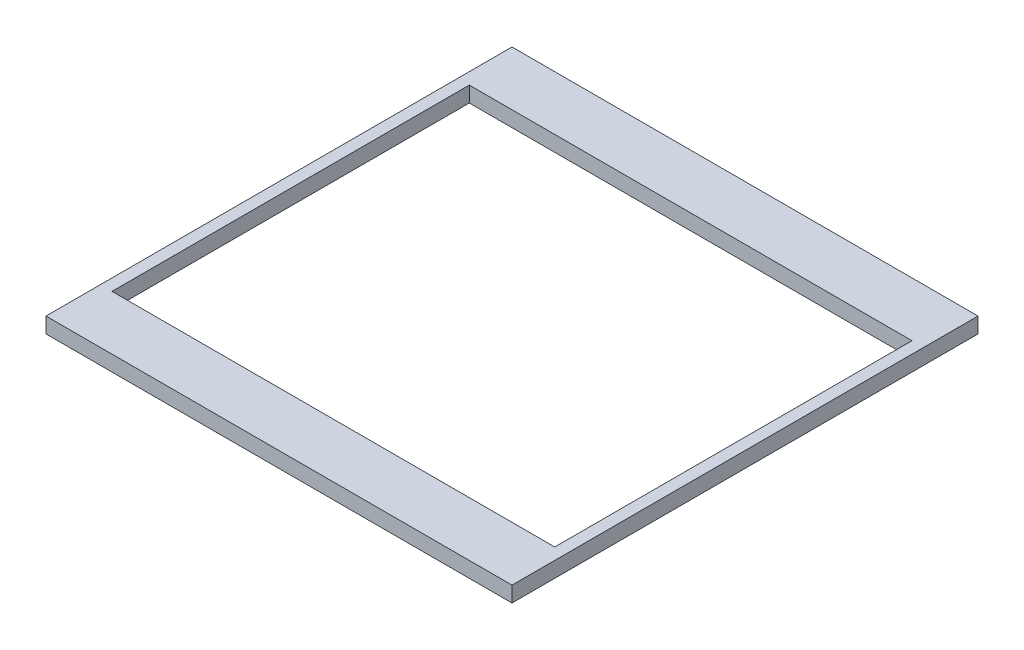
ISO-10303-21;
HEADER;
FILE_DESCRIPTION(('STEP AP214'),'2;1');
FILE_NAME('part.step','',(''),(''),'','','');
FILE_SCHEMA(('AUTOMOTIVE_DESIGN { 1 0 10303 214 1 1 1 1 }'));
ENDSEC;
DATA;
#1=APPLICATION_CONTEXT('core data for automotive mechanical design processes');
#2=APPLICATION_PROTOCOL_DEFINITION('international standard','automotive_design',2000,#1);
#3=PRODUCT_CONTEXT('',#1,'mechanical');
#4=PRODUCT('Part','Part','',(#3));
#5=PRODUCT_RELATED_PRODUCT_CATEGORY('part','',(#4));
#6=PRODUCT_DEFINITION_FORMATION('','',#4);
#7=PRODUCT_DEFINITION_CONTEXT('part definition',#1,'design');
#8=PRODUCT_DEFINITION('design','',#6,#7);
#9=PRODUCT_DEFINITION_SHAPE('','',#8);
#10=(LENGTH_UNIT() NAMED_UNIT(*) SI_UNIT(.MILLI.,.METRE.));
#11=(NAMED_UNIT(*) PLANE_ANGLE_UNIT() SI_UNIT($,.RADIAN.));
#12=(NAMED_UNIT(*) SI_UNIT($,.STERADIAN.) SOLID_ANGLE_UNIT());
#13=UNCERTAINTY_MEASURE_WITH_UNIT(LENGTH_MEASURE(1.E-05),#10,'distance_accuracy_value','');
#14=(GEOMETRIC_REPRESENTATION_CONTEXT(3) GLOBAL_UNCERTAINTY_ASSIGNED_CONTEXT((#13)) GLOBAL_UNIT_ASSIGNED_CONTEXT((#10,
#11,#12)) REPRESENTATION_CONTEXT('',''));
#15=CARTESIAN_POINT('',(0.,0.,0.));
#16=DIRECTION('',(0.,0.,1.));
#17=DIRECTION('',(1.,0.,0.));
#18=AXIS2_PLACEMENT_3D('',#15,#16,#17);
#19=CARTESIAN_POINT('',(38.1,2.54,38.1));
#20=DIRECTION('',(-1.,0.,0.));
#21=DIRECTION('',(0.,0.,1.));
#22=AXIS2_PLACEMENT_3D('',#19,#20,#21);
#23=PLANE('',#22);
#24=DIRECTION('',(0.,0.,-1.));
#25=VECTOR('',#24,1.);
#26=CARTESIAN_POINT('',(38.1,0.,38.1));
#27=LINE('',#26,#25);
#28=CARTESIAN_POINT('',(38.1,0.,38.1));
#29=VERTEX_POINT('',#28);
#30=CARTESIAN_POINT('',(38.1,0.,-38.1));
#31=VERTEX_POINT('',#30);
#32=EDGE_CURVE('E130',#29,#31,#27,.T.);
#33=ORIENTED_EDGE('',*,*,#32,.T.);
#34=DIRECTION('',(0.,-1.,0.));
#35=VECTOR('',#34,1.);
#36=CARTESIAN_POINT('',(38.1,2.54,-38.1));
#37=LINE('',#36,#35);
#38=CARTESIAN_POINT('',(38.1,2.54,-38.1));
#39=VERTEX_POINT('',#38);
#40=EDGE_CURVE('E11',#39,#31,#37,.T.);
#41=ORIENTED_EDGE('',*,*,#40,.F.);
#42=DIRECTION('',(0.,0.,-1.));
#43=VECTOR('',#42,1.);
#44=CARTESIAN_POINT('',(38.1,2.54,38.1));
#45=LINE('',#44,#43);
#46=CARTESIAN_POINT('',(38.1,2.54,38.1));
#47=VERTEX_POINT('',#46);
#48=EDGE_CURVE('E134',#47,#39,#45,.T.);
#49=ORIENTED_EDGE('',*,*,#48,.F.);
#50=DIRECTION('',(0.,-1.,0.));
#51=VECTOR('',#50,1.);
#52=CARTESIAN_POINT('',(38.1,2.54,38.1));
#53=LINE('',#52,#51);
#54=EDGE_CURVE('E144',#47,#29,#53,.T.);
#55=ORIENTED_EDGE('',*,*,#54,.T.);
#56=EDGE_LOOP('',(#33,#41,#49,#55));
#57=FACE_BOUND('',#56,.T.);
#58=ADVANCED_FACE('F33',(#57),#23,.F.);
#59=CARTESIAN_POINT('',(-38.1,2.54,-38.1));
#60=DIRECTION('',(0.,0.,1.));
#61=DIRECTION('',(1.,0.,0.));
#62=AXIS2_PLACEMENT_3D('',#59,#60,#61);
#63=PLANE('',#62);
#64=DIRECTION('',(-1.,0.,0.));
#65=VECTOR('',#64,1.);
#66=CARTESIAN_POINT('',(-38.1,0.,-38.1));
#67=LINE('',#66,#65);
#68=CARTESIAN_POINT('',(-38.1,0.,-38.1));
#69=VERTEX_POINT('',#68);
#70=EDGE_CURVE('E147',#31,#69,#67,.T.);
#71=ORIENTED_EDGE('',*,*,#70,.T.);
#72=DIRECTION('',(0.,-1.,0.));
#73=VECTOR('',#72,1.);
#74=CARTESIAN_POINT('',(-38.1,2.54,-38.1));
#75=LINE('',#74,#73);
#76=CARTESIAN_POINT('',(-38.1,2.54,-38.1));
#77=VERTEX_POINT('',#76);
#78=EDGE_CURVE('E40',#77,#69,#75,.T.);
#79=ORIENTED_EDGE('',*,*,#78,.F.);
#80=DIRECTION('',(-1.,0.,0.));
#81=VECTOR('',#80,1.);
#82=CARTESIAN_POINT('',(-38.1,2.54,-38.1));
#83=LINE('',#82,#81);
#84=EDGE_CURVE('E137',#39,#77,#83,.T.);
#85=ORIENTED_EDGE('',*,*,#84,.F.);
#86=ORIENTED_EDGE('',*,*,#40,.T.);
#87=EDGE_LOOP('',(#71,#79,#85,#86));
#88=FACE_BOUND('',#87,.T.);
#89=ADVANCED_FACE('F175',(#88),#63,.F.);
#90=CARTESIAN_POINT('',(-38.1,2.54,38.1));
#91=DIRECTION('',(1.,0.,0.));
#92=DIRECTION('',(0.,0.,-1.));
#93=AXIS2_PLACEMENT_3D('',#90,#91,#92);
#94=PLANE('',#93);
#95=DIRECTION('',(0.,0.,1.));
#96=VECTOR('',#95,1.);
#97=CARTESIAN_POINT('',(-38.1,0.,38.1));
#98=LINE('',#97,#96);
#99=CARTESIAN_POINT('',(-38.1,0.,38.1));
#100=VERTEX_POINT('',#99);
#101=EDGE_CURVE('E149',#69,#100,#98,.T.);
#102=ORIENTED_EDGE('',*,*,#101,.T.);
#103=DIRECTION('',(0.,-1.,0.));
#104=VECTOR('',#103,1.);
#105=CARTESIAN_POINT('',(-38.1,2.54,38.1));
#106=LINE('',#105,#104);
#107=CARTESIAN_POINT('',(-38.1,2.54,38.1));
#108=VERTEX_POINT('',#107);
#109=EDGE_CURVE('E154',#108,#100,#106,.T.);
#110=ORIENTED_EDGE('',*,*,#109,.F.);
#111=DIRECTION('',(0.,0.,1.));
#112=VECTOR('',#111,1.);
#113=CARTESIAN_POINT('',(-38.1,2.54,38.1));
#114=LINE('',#113,#112);
#115=EDGE_CURVE('E140',#77,#108,#114,.T.);
#116=ORIENTED_EDGE('',*,*,#115,.F.);
#117=ORIENTED_EDGE('',*,*,#78,.T.);
#118=EDGE_LOOP('',(#102,#110,#116,#117));
#119=FACE_BOUND('',#118,.T.);
#120=ADVANCED_FACE('F161',(#119),#94,.F.);
#121=CARTESIAN_POINT('',(-38.1,2.54,38.1));
#122=DIRECTION('',(0.,0.,-1.));
#123=DIRECTION('',(-1.,0.,0.));
#124=AXIS2_PLACEMENT_3D('',#121,#122,#123);
#125=PLANE('',#124);
#126=DIRECTION('',(1.,0.,0.));
#127=VECTOR('',#126,1.);
#128=CARTESIAN_POINT('',(-38.1,0.,38.1));
#129=LINE('',#128,#127);
#130=EDGE_CURVE('E138',#100,#29,#129,.T.);
#131=ORIENTED_EDGE('',*,*,#130,.T.);
#132=ORIENTED_EDGE('',*,*,#54,.F.);
#133=DIRECTION('',(1.,0.,0.));
#134=VECTOR('',#133,1.);
#135=CARTESIAN_POINT('',(-38.1,2.54,38.1));
#136=LINE('',#135,#134);
#137=EDGE_CURVE('E142',#108,#47,#136,.T.);
#138=ORIENTED_EDGE('',*,*,#137,.F.);
#139=ORIENTED_EDGE('',*,*,#109,.T.);
#140=EDGE_LOOP('',(#131,#132,#138,#139));
#141=FACE_BOUND('',#140,.T.);
#142=ADVANCED_FACE('F168',(#141),#125,.F.);
#143=CARTESIAN_POINT('',(0.,2.54,0.));
#144=DIRECTION('',(0.,-1.,0.));
#145=DIRECTION('',(0.,0.,-1.));
#146=AXIS2_PLACEMENT_3D('',#143,#144,#145);
#147=PLANE('',#146);
#148=DIRECTION('',(-1.,0.,0.));
#149=VECTOR('',#148,1.);
#150=CARTESIAN_POINT('',(-36.195,2.54,-29.21));
#151=LINE('',#150,#149);
#152=CARTESIAN_POINT('',(36.195,2.54,-29.21));
#153=VERTEX_POINT('',#152);
#154=CARTESIAN_POINT('',(-36.195,2.54,-29.21));
#155=VERTEX_POINT('',#154);
#156=EDGE_CURVE('E124',#153,#155,#151,.T.);
#157=ORIENTED_EDGE('',*,*,#156,.F.);
#158=DIRECTION('',(0.,0.,-1.));
#159=VECTOR('',#158,1.);
#160=CARTESIAN_POINT('',(36.195,2.54,29.21));
#161=LINE('',#160,#159);
#162=CARTESIAN_POINT('',(36.195,2.54,29.21));
#163=VERTEX_POINT('',#162);
#164=EDGE_CURVE('E47',#163,#153,#161,.T.);
#165=ORIENTED_EDGE('',*,*,#164,.F.);
#166=DIRECTION('',(1.,0.,0.));
#167=VECTOR('',#166,1.);
#168=CARTESIAN_POINT('',(-36.195,2.54,29.21));
#169=LINE('',#168,#167);
#170=CARTESIAN_POINT('',(-36.195,2.54,29.21));
#171=VERTEX_POINT('',#170);
#172=EDGE_CURVE('E115',#171,#163,#169,.T.);
#173=ORIENTED_EDGE('',*,*,#172,.F.);
#174=DIRECTION('',(0.,0.,1.));
#175=VECTOR('',#174,1.);
#176=CARTESIAN_POINT('',(-36.195,2.54,29.21));
#177=LINE('',#176,#175);
#178=EDGE_CURVE('E118',#155,#171,#177,.T.);
#179=ORIENTED_EDGE('',*,*,#178,.F.);
#180=EDGE_LOOP('',(#157,#165,#173,#179));
#181=FACE_BOUND('',#180,.T.);
#182=ORIENTED_EDGE('',*,*,#48,.T.);
#183=ORIENTED_EDGE('',*,*,#84,.T.);
#184=ORIENTED_EDGE('',*,*,#115,.T.);
#185=ORIENTED_EDGE('',*,*,#137,.T.);
#186=EDGE_LOOP('',(#182,#183,#184,#185));
#187=FACE_BOUND('',#186,.T.);
#188=ADVANCED_FACE('F174',(#181,#187),#147,.F.);
#189=CARTESIAN_POINT('',(0.,0.,0.));
#190=DIRECTION('',(0.,-1.,0.));
#191=DIRECTION('',(0.,0.,-1.));
#192=AXIS2_PLACEMENT_3D('',#189,#190,#191);
#193=PLANE('',#192);
#194=DIRECTION('',(0.,0.,-1.));
#195=VECTOR('',#194,1.);
#196=CARTESIAN_POINT('',(36.195,0.,29.21));
#197=LINE('',#196,#195);
#198=CARTESIAN_POINT('',(36.195,0.,29.21));
#199=VERTEX_POINT('',#198);
#200=CARTESIAN_POINT('',(36.195,0.,-29.21));
#201=VERTEX_POINT('',#200);
#202=EDGE_CURVE('E99',#199,#201,#197,.T.);
#203=ORIENTED_EDGE('',*,*,#202,.T.);
#204=DIRECTION('',(-1.,0.,0.));
#205=VECTOR('',#204,1.);
#206=CARTESIAN_POINT('',(-36.195,0.,-29.21));
#207=LINE('',#206,#205);
#208=CARTESIAN_POINT('',(-36.195,0.,-29.21));
#209=VERTEX_POINT('',#208);
#210=EDGE_CURVE('E108',#201,#209,#207,.T.);
#211=ORIENTED_EDGE('',*,*,#210,.T.);
#212=DIRECTION('',(0.,0.,1.));
#213=VECTOR('',#212,1.);
#214=CARTESIAN_POINT('',(-36.195,0.,29.21));
#215=LINE('',#214,#213);
#216=CARTESIAN_POINT('',(-36.195,0.,29.21));
#217=VERTEX_POINT('',#216);
#218=EDGE_CURVE('E55',#209,#217,#215,.T.);
#219=ORIENTED_EDGE('',*,*,#218,.T.);
#220=DIRECTION('',(1.,0.,0.));
#221=VECTOR('',#220,1.);
#222=CARTESIAN_POINT('',(-36.195,0.,29.21));
#223=LINE('',#222,#221);
#224=EDGE_CURVE('E105',#217,#199,#223,.T.);
#225=ORIENTED_EDGE('',*,*,#224,.T.);
#226=EDGE_LOOP('',(#203,#211,#219,#225));
#227=FACE_BOUND('',#226,.T.);
#228=ORIENTED_EDGE('',*,*,#32,.F.);
#229=ORIENTED_EDGE('',*,*,#130,.F.);
#230=ORIENTED_EDGE('',*,*,#101,.F.);
#231=ORIENTED_EDGE('',*,*,#70,.F.);
#232=EDGE_LOOP('',(#228,#229,#230,#231));
#233=FACE_BOUND('',#232,.T.);
#234=ADVANCED_FACE('F112',(#227,#233),#193,.T.);
#235=CARTESIAN_POINT('',(36.195,0.,29.21));
#236=DIRECTION('',(1.,0.,0.));
#237=DIRECTION('',(0.,0.,-1.));
#238=AXIS2_PLACEMENT_3D('',#235,#236,#237);
#239=PLANE('',#238);
#240=ORIENTED_EDGE('',*,*,#164,.T.);
#241=DIRECTION('',(0.,1.,0.));
#242=VECTOR('',#241,1.);
#243=CARTESIAN_POINT('',(36.195,0.,-29.21));
#244=LINE('',#243,#242);
#245=EDGE_CURVE('E95',#201,#153,#244,.T.);
#246=ORIENTED_EDGE('',*,*,#245,.F.);
#247=ORIENTED_EDGE('',*,*,#202,.F.);
#248=DIRECTION('',(0.,1.,0.));
#249=VECTOR('',#248,1.);
#250=CARTESIAN_POINT('',(36.195,0.,29.21));
#251=LINE('',#250,#249);
#252=EDGE_CURVE('E128',#199,#163,#251,.T.);
#253=ORIENTED_EDGE('',*,*,#252,.T.);
#254=EDGE_LOOP('',(#240,#246,#247,#253));
#255=FACE_BOUND('',#254,.T.);
#256=ADVANCED_FACE('F97',(#255),#239,.F.);
#257=CARTESIAN_POINT('',(-36.195,0.,29.21));
#258=DIRECTION('',(0.,0.,1.));
#259=DIRECTION('',(1.,0.,0.));
#260=AXIS2_PLACEMENT_3D('',#257,#258,#259);
#261=PLANE('',#260);
#262=ORIENTED_EDGE('',*,*,#172,.T.);
#263=ORIENTED_EDGE('',*,*,#252,.F.);
#264=ORIENTED_EDGE('',*,*,#224,.F.);
#265=DIRECTION('',(0.,1.,0.));
#266=VECTOR('',#265,1.);
#267=CARTESIAN_POINT('',(-36.195,0.,29.21));
#268=LINE('',#267,#266);
#269=EDGE_CURVE('E131',#217,#171,#268,.T.);
#270=ORIENTED_EDGE('',*,*,#269,.T.);
#271=EDGE_LOOP('',(#262,#263,#264,#270));
#272=FACE_BOUND('',#271,.T.);
#273=ADVANCED_FACE('F192',(#272),#261,.F.);
#274=CARTESIAN_POINT('',(-36.195,0.,29.21));
#275=DIRECTION('',(-1.,0.,0.));
#276=DIRECTION('',(0.,0.,1.));
#277=AXIS2_PLACEMENT_3D('',#274,#275,#276);
#278=PLANE('',#277);
#279=ORIENTED_EDGE('',*,*,#178,.T.);
#280=ORIENTED_EDGE('',*,*,#269,.F.);
#281=ORIENTED_EDGE('',*,*,#218,.F.);
#282=DIRECTION('',(0.,1.,0.));
#283=VECTOR('',#282,1.);
#284=CARTESIAN_POINT('',(-36.195,0.,-29.21));
#285=LINE('',#284,#283);
#286=EDGE_CURVE('E104',#209,#155,#285,.T.);
#287=ORIENTED_EDGE('',*,*,#286,.T.);
#288=EDGE_LOOP('',(#279,#280,#281,#287));
#289=FACE_BOUND('',#288,.T.);
#290=ADVANCED_FACE('F195',(#289),#278,.F.);
#291=CARTESIAN_POINT('',(-36.195,0.,-29.21));
#292=DIRECTION('',(0.,0.,-1.));
#293=DIRECTION('',(-1.,0.,0.));
#294=AXIS2_PLACEMENT_3D('',#291,#292,#293);
#295=PLANE('',#294);
#296=ORIENTED_EDGE('',*,*,#156,.T.);
#297=ORIENTED_EDGE('',*,*,#286,.F.);
#298=ORIENTED_EDGE('',*,*,#210,.F.);
#299=ORIENTED_EDGE('',*,*,#245,.T.);
#300=EDGE_LOOP('',(#296,#297,#298,#299));
#301=FACE_BOUND('',#300,.T.);
#302=ADVANCED_FACE('F109',(#301),#295,.F.);
#303=CLOSED_SHELL('',(#58,#89,#120,#142,#188,#234,#256,#273,#290,#302));
#304=MANIFOLD_SOLID_BREP('B2',#303);
#305=ADVANCED_BREP_SHAPE_REPRESENTATION('',(#18,#304),#14);
#306=SHAPE_DEFINITION_REPRESENTATION(#9,#305);
ENDSEC;
END-ISO-10303-21;
